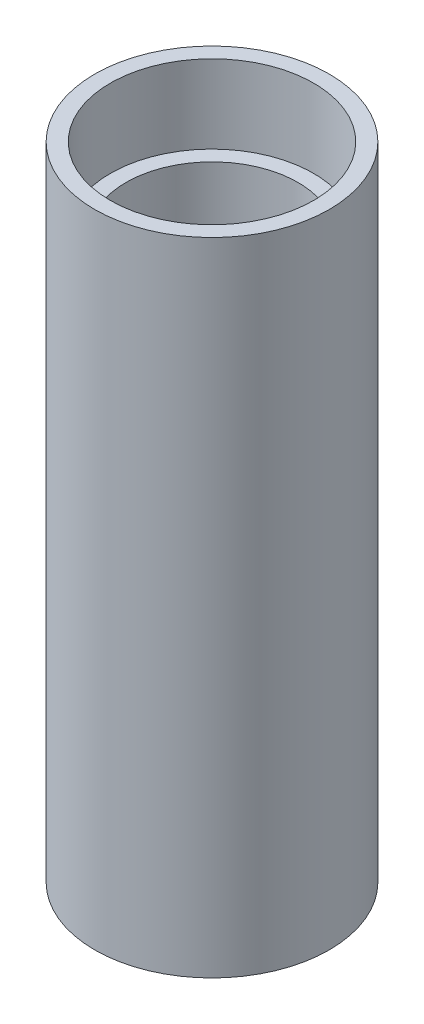
ISO-10303-21;
HEADER;
FILE_DESCRIPTION(('STEP AP214'),'2;1');
FILE_NAME('part.step','',(''),(''),'','','');
FILE_SCHEMA(('AUTOMOTIVE_DESIGN { 1 0 10303 214 1 1 1 1 }'));
ENDSEC;
DATA;
#1=APPLICATION_CONTEXT('core data for automotive mechanical design processes');
#2=APPLICATION_PROTOCOL_DEFINITION('international standard','automotive_design',2000,#1);
#3=PRODUCT_CONTEXT('',#1,'mechanical');
#4=PRODUCT('Part','Part','',(#3));
#5=PRODUCT_RELATED_PRODUCT_CATEGORY('part','',(#4));
#6=PRODUCT_DEFINITION_FORMATION('','',#4);
#7=PRODUCT_DEFINITION_CONTEXT('part definition',#1,'design');
#8=PRODUCT_DEFINITION('design','',#6,#7);
#9=PRODUCT_DEFINITION_SHAPE('','',#8);
#10=(LENGTH_UNIT() NAMED_UNIT(*) SI_UNIT(.MILLI.,.METRE.));
#11=(NAMED_UNIT(*) PLANE_ANGLE_UNIT() SI_UNIT($,.RADIAN.));
#12=(NAMED_UNIT(*) SI_UNIT($,.STERADIAN.) SOLID_ANGLE_UNIT());
#13=UNCERTAINTY_MEASURE_WITH_UNIT(LENGTH_MEASURE(1.E-05),#10,'distance_accuracy_value','');
#14=(GEOMETRIC_REPRESENTATION_CONTEXT(3) GLOBAL_UNCERTAINTY_ASSIGNED_CONTEXT((#13)) GLOBAL_UNIT_ASSIGNED_CONTEXT((#10,
#11,#12)) REPRESENTATION_CONTEXT('',''));
#15=CARTESIAN_POINT('',(0.,0.,0.));
#16=DIRECTION('',(0.,0.,1.));
#17=DIRECTION('',(1.,0.,0.));
#18=AXIS2_PLACEMENT_3D('',#15,#16,#17);
#19=CARTESIAN_POINT('',(0.,-20.5,0.));
#20=DIRECTION('',(0.,1.,0.));
#21=DIRECTION('',(0.,0.,1.));
#22=AXIS2_PLACEMENT_3D('',#19,#20,#21);
#23=CYLINDRICAL_SURFACE('',#22,5.5);
#24=CARTESIAN_POINT('',(0.,-15.5,0.));
#25=DIRECTION('',(0.,1.,0.));
#26=DIRECTION('',(0.,0.,1.));
#27=AXIS2_PLACEMENT_3D('',#24,#25,#26);
#28=CIRCLE('',#27,5.5);
#29=CARTESIAN_POINT('',(0.,-15.5,5.5));
#30=VERTEX_POINT('',#29);
#31=EDGE_CURVE('E39',#30,#30,#28,.T.);
#32=ORIENTED_EDGE('',*,*,#31,.F.);
#33=EDGE_LOOP('',(#32));
#34=FACE_BOUND('',#33,.T.);
#35=CARTESIAN_POINT('',(0.,15.5,0.));
#36=DIRECTION('',(0.,1.,0.));
#37=DIRECTION('',(0.,0.,1.));
#38=AXIS2_PLACEMENT_3D('',#35,#36,#37);
#39=CIRCLE('',#38,5.5);
#40=CARTESIAN_POINT('',(0.,15.5,5.5));
#41=VERTEX_POINT('',#40);
#42=EDGE_CURVE('E17',#41,#41,#39,.F.);
#43=ORIENTED_EDGE('',*,*,#42,.F.);
#44=EDGE_LOOP('',(#43));
#45=FACE_BOUND('',#44,.T.);
#46=ADVANCED_FACE('F14',(#34,#45),#23,.F.);
#47=CARTESIAN_POINT('',(0.,15.5,0.));
#48=DIRECTION('',(0.,1.,0.));
#49=DIRECTION('',(0.,0.,1.));
#50=AXIS2_PLACEMENT_3D('',#47,#48,#49);
#51=PLANE('',#50);
#52=CARTESIAN_POINT('',(0.,15.5,0.));
#53=DIRECTION('',(0.,1.,0.));
#54=DIRECTION('',(0.,0.,1.));
#55=AXIS2_PLACEMENT_3D('',#52,#53,#54);
#56=CIRCLE('',#55,6.5);
#57=CARTESIAN_POINT('',(0.,15.5,6.5));
#58=VERTEX_POINT('',#57);
#59=EDGE_CURVE('E37',#58,#58,#56,.T.);
#60=ORIENTED_EDGE('',*,*,#59,.T.);
#61=EDGE_LOOP('',(#60));
#62=FACE_BOUND('',#61,.T.);
#63=ORIENTED_EDGE('',*,*,#42,.T.);
#64=EDGE_LOOP('',(#63));
#65=FACE_BOUND('',#64,.T.);
#66=ADVANCED_FACE('F46',(#62,#65),#51,.T.);
#67=CARTESIAN_POINT('',(0.,-15.5,0.));
#68=DIRECTION('',(0.,-1.,0.));
#69=DIRECTION('',(0.,0.,-1.));
#70=AXIS2_PLACEMENT_3D('',#67,#68,#69);
#71=PLANE('',#70);
#72=CARTESIAN_POINT('',(0.,-15.5,0.));
#73=DIRECTION('',(0.,-1.,0.));
#74=DIRECTION('',(0.,0.,-1.));
#75=AXIS2_PLACEMENT_3D('',#72,#73,#74);
#76=CIRCLE('',#75,6.5);
#77=CARTESIAN_POINT('',(0.,-15.5,-6.5));
#78=VERTEX_POINT('',#77);
#79=EDGE_CURVE('E34',#78,#78,#76,.T.);
#80=ORIENTED_EDGE('',*,*,#79,.T.);
#81=EDGE_LOOP('',(#80));
#82=FACE_BOUND('',#81,.T.);
#83=ORIENTED_EDGE('',*,*,#31,.T.);
#84=EDGE_LOOP('',(#83));
#85=FACE_BOUND('',#84,.T.);
#86=ADVANCED_FACE('F54',(#82,#85),#71,.T.);
#87=CARTESIAN_POINT('',(0.,15.5,0.));
#88=DIRECTION('',(0.,1.,0.));
#89=DIRECTION('',(0.,0.,1.));
#90=AXIS2_PLACEMENT_3D('',#87,#88,#89);
#91=CYLINDRICAL_SURFACE('',#90,6.5);
#92=CARTESIAN_POINT('',(0.,20.5,0.));
#93=DIRECTION('',(0.,1.,0.));
#94=DIRECTION('',(0.,0.,1.));
#95=AXIS2_PLACEMENT_3D('',#92,#93,#94);
#96=CIRCLE('',#95,6.5);
#97=CARTESIAN_POINT('',(0.,20.5,6.5));
#98=VERTEX_POINT('',#97);
#99=EDGE_CURVE('E31',#98,#98,#96,.F.);
#100=ORIENTED_EDGE('',*,*,#99,.F.);
#101=EDGE_LOOP('',(#100));
#102=FACE_BOUND('',#101,.T.);
#103=ORIENTED_EDGE('',*,*,#59,.F.);
#104=EDGE_LOOP('',(#103));
#105=FACE_BOUND('',#104,.T.);
#106=ADVANCED_FACE('F75',(#102,#105),#91,.F.);
#107=CARTESIAN_POINT('',(0.,-15.5,0.));
#108=DIRECTION('',(0.,-1.,0.));
#109=DIRECTION('',(0.,0.,-1.));
#110=AXIS2_PLACEMENT_3D('',#107,#108,#109);
#111=CYLINDRICAL_SURFACE('',#110,6.5);
#112=CARTESIAN_POINT('',(0.,-20.5,0.));
#113=DIRECTION('',(0.,-1.,0.));
#114=DIRECTION('',(0.,0.,-1.));
#115=AXIS2_PLACEMENT_3D('',#112,#113,#114);
#116=CIRCLE('',#115,6.5);
#117=CARTESIAN_POINT('',(0.,-20.5,-6.5));
#118=VERTEX_POINT('',#117);
#119=EDGE_CURVE('E26',#118,#118,#116,.T.);
#120=ORIENTED_EDGE('',*,*,#119,.T.);
#121=EDGE_LOOP('',(#120));
#122=FACE_BOUND('',#121,.T.);
#123=ORIENTED_EDGE('',*,*,#79,.F.);
#124=EDGE_LOOP('',(#123));
#125=FACE_BOUND('',#124,.T.);
#126=ADVANCED_FACE('F71',(#122,#125),#111,.F.);
#127=CARTESIAN_POINT('',(0.,20.5,0.));
#128=DIRECTION('',(0.,1.,0.));
#129=DIRECTION('',(0.,0.,1.));
#130=AXIS2_PLACEMENT_3D('',#127,#128,#129);
#131=PLANE('',#130);
#132=CARTESIAN_POINT('',(0.,20.5,0.));
#133=DIRECTION('',(0.,-1.,0.));
#134=DIRECTION('',(0.,0.,-1.));
#135=AXIS2_PLACEMENT_3D('',#132,#133,#134);
#136=CIRCLE('',#135,7.5);
#137=CARTESIAN_POINT('',(0.,20.5,-7.5));
#138=VERTEX_POINT('',#137);
#139=EDGE_CURVE('E21',#138,#138,#136,.T.);
#140=ORIENTED_EDGE('',*,*,#139,.F.);
#141=EDGE_LOOP('',(#140));
#142=FACE_BOUND('',#141,.T.);
#143=ORIENTED_EDGE('',*,*,#99,.T.);
#144=EDGE_LOOP('',(#143));
#145=FACE_BOUND('',#144,.T.);
#146=ADVANCED_FACE('F64',(#142,#145),#131,.T.);
#147=CARTESIAN_POINT('',(0.,-20.5,0.));
#148=DIRECTION('',(0.,1.,0.));
#149=DIRECTION('',(0.,0.,1.));
#150=AXIS2_PLACEMENT_3D('',#147,#148,#149);
#151=PLANE('',#150);
#152=ORIENTED_EDGE('',*,*,#119,.F.);
#153=EDGE_LOOP('',(#152));
#154=FACE_BOUND('',#153,.T.);
#155=CARTESIAN_POINT('',(0.,-20.5,0.));
#156=DIRECTION('',(0.,-1.,0.));
#157=DIRECTION('',(0.,0.,-1.));
#158=AXIS2_PLACEMENT_3D('',#155,#156,#157);
#159=CIRCLE('',#158,7.5);
#160=CARTESIAN_POINT('',(0.,-20.5,-7.5));
#161=VERTEX_POINT('',#160);
#162=EDGE_CURVE('E10',#161,#161,#159,.F.);
#163=ORIENTED_EDGE('',*,*,#162,.F.);
#164=EDGE_LOOP('',(#163));
#165=FACE_BOUND('',#164,.T.);
#166=ADVANCED_FACE('F58',(#154,#165),#151,.F.);
#167=CARTESIAN_POINT('',(0.,20.5,0.));
#168=DIRECTION('',(0.,-1.,0.));
#169=DIRECTION('',(0.,0.,-1.));
#170=AXIS2_PLACEMENT_3D('',#167,#168,#169);
#171=CYLINDRICAL_SURFACE('',#170,7.5);
#172=ORIENTED_EDGE('',*,*,#162,.T.);
#173=EDGE_LOOP('',(#172));
#174=FACE_BOUND('',#173,.T.);
#175=ORIENTED_EDGE('',*,*,#139,.T.);
#176=EDGE_LOOP('',(#175));
#177=FACE_BOUND('',#176,.T.);
#178=ADVANCED_FACE('F56',(#174,#177),#171,.T.);
#179=CLOSED_SHELL('',(#46,#66,#86,#106,#126,#146,#166,#178));
#180=MANIFOLD_SOLID_BREP('B1',#179);
#181=ADVANCED_BREP_SHAPE_REPRESENTATION('',(#18,#180),#14);
#182=SHAPE_DEFINITION_REPRESENTATION(#9,#181);
ENDSEC;
END-ISO-10303-21;
